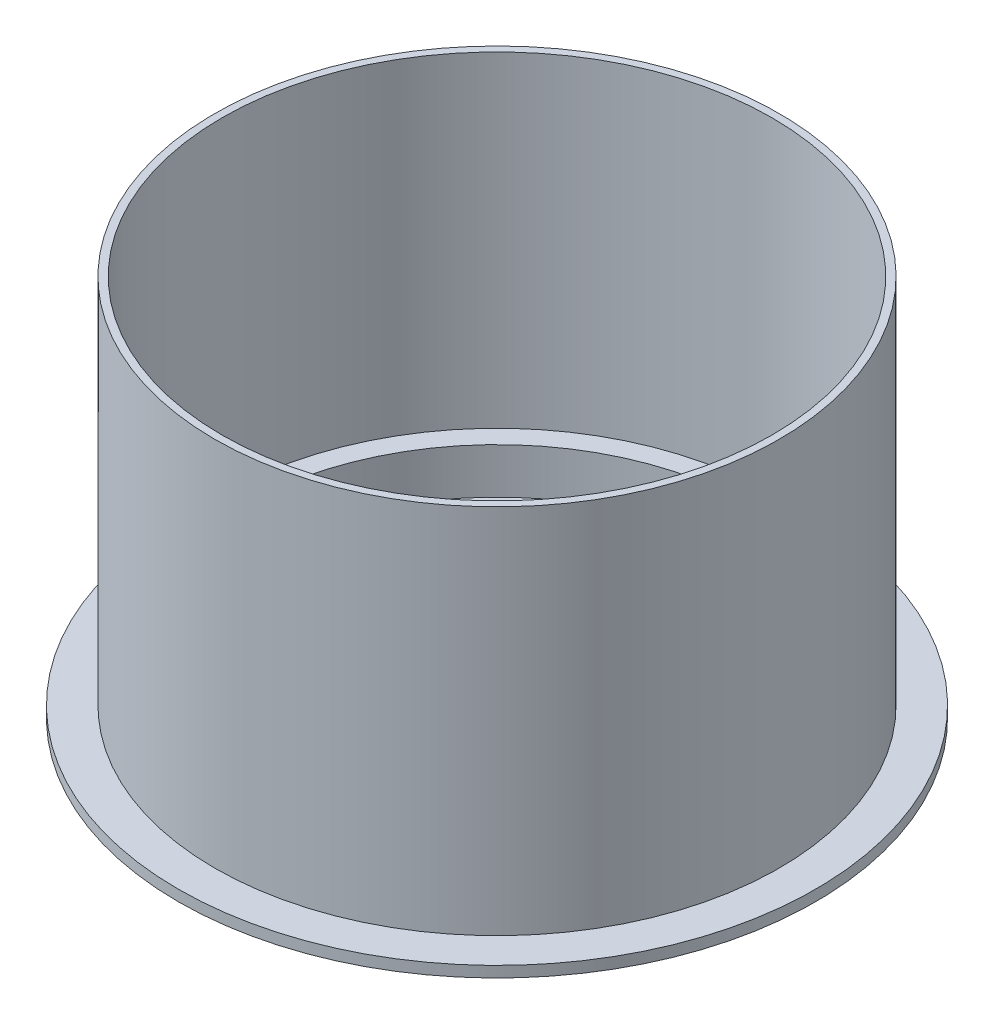
ISO-10303-21;
HEADER;
FILE_DESCRIPTION(('STEP AP214'),'2;1');
FILE_NAME('part.step','',(''),(''),'','','');
FILE_SCHEMA(('AUTOMOTIVE_DESIGN { 1 0 10303 214 1 1 1 1 }'));
ENDSEC;
DATA;
#1=APPLICATION_CONTEXT('core data for automotive mechanical design processes');
#2=APPLICATION_PROTOCOL_DEFINITION('international standard','automotive_design',2000,#1);
#3=PRODUCT_CONTEXT('',#1,'mechanical');
#4=PRODUCT('Part','Part','',(#3));
#5=PRODUCT_RELATED_PRODUCT_CATEGORY('part','',(#4));
#6=PRODUCT_DEFINITION_FORMATION('','',#4);
#7=PRODUCT_DEFINITION_CONTEXT('part definition',#1,'design');
#8=PRODUCT_DEFINITION('design','',#6,#7);
#9=PRODUCT_DEFINITION_SHAPE('','',#8);
#10=(LENGTH_UNIT() NAMED_UNIT(*) SI_UNIT(.MILLI.,.METRE.));
#11=(NAMED_UNIT(*) PLANE_ANGLE_UNIT() SI_UNIT($,.RADIAN.));
#12=(NAMED_UNIT(*) SI_UNIT($,.STERADIAN.) SOLID_ANGLE_UNIT());
#13=UNCERTAINTY_MEASURE_WITH_UNIT(LENGTH_MEASURE(1.E-05),#10,'distance_accuracy_value','');
#14=(GEOMETRIC_REPRESENTATION_CONTEXT(3) GLOBAL_UNCERTAINTY_ASSIGNED_CONTEXT((#13)) GLOBAL_UNIT_ASSIGNED_CONTEXT((#10,
#11,#12)) REPRESENTATION_CONTEXT('',''));
#15=CARTESIAN_POINT('',(0.,0.,0.));
#16=DIRECTION('',(0.,0.,1.));
#17=DIRECTION('',(1.,0.,0.));
#18=AXIS2_PLACEMENT_3D('',#15,#16,#17);
#19=CARTESIAN_POINT('',(0.,31.,0.));
#20=DIRECTION('',(0.,1.,0.));
#21=DIRECTION('',(0.,0.,1.));
#22=AXIS2_PLACEMENT_3D('',#19,#20,#21);
#23=PLANE('',#22);
#24=CARTESIAN_POINT('',(0.,31.,0.));
#25=DIRECTION('',(0.,1.,0.));
#26=DIRECTION('',(0.,0.,1.));
#27=AXIS2_PLACEMENT_3D('',#24,#25,#26);
#28=CIRCLE('',#27,140.);
#29=CARTESIAN_POINT('',(0.,31.,140.));
#30=VERTEX_POINT('',#29);
#31=EDGE_CURVE('E62',#30,#30,#28,.T.);
#32=ORIENTED_EDGE('',*,*,#31,.F.);
#33=EDGE_LOOP('',(#32));
#34=FACE_BOUND('',#33,.T.);
#35=CARTESIAN_POINT('',(0.,31.,0.));
#36=DIRECTION('',(0.,1.,0.));
#37=DIRECTION('',(0.,0.,1.));
#38=AXIS2_PLACEMENT_3D('',#35,#36,#37);
#39=CIRCLE('',#38,151.);
#40=CARTESIAN_POINT('',(0.,31.,151.));
#41=VERTEX_POINT('',#40);
#42=EDGE_CURVE('E10',#41,#41,#39,.F.);
#43=ORIENTED_EDGE('',*,*,#42,.F.);
#44=EDGE_LOOP('',(#43));
#45=FACE_BOUND('',#44,.T.);
#46=ADVANCED_FACE('F41',(#34,#45),#23,.T.);
#47=CARTESIAN_POINT('',(0.,6.,0.));
#48=DIRECTION('',(0.,1.,0.));
#49=DIRECTION('',(0.,0.,1.));
#50=AXIS2_PLACEMENT_3D('',#47,#48,#49);
#51=PLANE('',#50);
#52=CARTESIAN_POINT('',(0.,6.,0.));
#53=DIRECTION('',(0.,1.,0.));
#54=DIRECTION('',(0.,0.,1.));
#55=AXIS2_PLACEMENT_3D('',#52,#53,#54);
#56=CIRCLE('',#55,12.5);
#57=CARTESIAN_POINT('',(0.,6.,12.5));
#58=VERTEX_POINT('',#57);
#59=EDGE_CURVE('E64',#58,#58,#56,.T.);
#60=ORIENTED_EDGE('',*,*,#59,.F.);
#61=EDGE_LOOP('',(#60));
#62=FACE_BOUND('',#61,.T.);
#63=CARTESIAN_POINT('',(0.,6.,0.));
#64=DIRECTION('',(0.,1.,0.));
#65=DIRECTION('',(0.,0.,1.));
#66=AXIS2_PLACEMENT_3D('',#63,#64,#65);
#67=CIRCLE('',#66,140.);
#68=CARTESIAN_POINT('',(0.,6.,140.));
#69=VERTEX_POINT('',#68);
#70=EDGE_CURVE('E48',#69,#69,#67,.F.);
#71=ORIENTED_EDGE('',*,*,#70,.F.);
#72=EDGE_LOOP('',(#71));
#73=FACE_BOUND('',#72,.T.);
#74=ADVANCED_FACE('F94',(#62,#73),#51,.T.);
#75=CARTESIAN_POINT('',(0.,6.00000000000001,0.));
#76=DIRECTION('',(0.,1.,0.));
#77=DIRECTION('',(0.,0.,1.));
#78=AXIS2_PLACEMENT_3D('',#75,#76,#77);
#79=CIRCLE('',#78,155.);
#80=CARTESIAN_POINT('',(0.,6.00000000000001,155.));
#81=VERTEX_POINT('',#80);
#82=EDGE_CURVE('E125',#81,#81,#79,.F.);
#83=ORIENTED_EDGE('',*,*,#82,.T.);
#84=EDGE_LOOP('',(#83));
#85=FACE_BOUND('',#84,.T.);
#86=CARTESIAN_POINT('',(0.,6.,0.));
#87=DIRECTION('',(0.,1.,0.));
#88=DIRECTION('',(0.,0.,1.));
#89=AXIS2_PLACEMENT_3D('',#86,#87,#88);
#90=CIRCLE('',#89,175.);
#91=CARTESIAN_POINT('',(0.,6.,175.));
#92=VERTEX_POINT('',#91);
#93=EDGE_CURVE('E55',#92,#92,#90,.T.);
#94=ORIENTED_EDGE('',*,*,#93,.T.);
#95=EDGE_LOOP('',(#94));
#96=FACE_BOUND('',#95,.T.);
#97=ADVANCED_FACE('F73',(#85,#96),#51,.T.);
#98=CARTESIAN_POINT('',(0.,0.,0.));
#99=DIRECTION('',(0.,1.,0.));
#100=DIRECTION('',(0.,0.,1.));
#101=AXIS2_PLACEMENT_3D('',#98,#99,#100);
#102=PLANE('',#101);
#103=CARTESIAN_POINT('',(0.,0.,0.));
#104=DIRECTION('',(0.,1.,0.));
#105=DIRECTION('',(0.,0.,1.));
#106=AXIS2_PLACEMENT_3D('',#103,#104,#105);
#107=CIRCLE('',#106,175.);
#108=CARTESIAN_POINT('',(0.,0.,175.));
#109=VERTEX_POINT('',#108);
#110=EDGE_CURVE('E60',#109,#109,#107,.T.);
#111=ORIENTED_EDGE('',*,*,#110,.F.);
#112=EDGE_LOOP('',(#111));
#113=FACE_BOUND('',#112,.T.);
#114=CARTESIAN_POINT('',(0.,0.,0.));
#115=DIRECTION('',(0.,1.,0.));
#116=DIRECTION('',(0.,0.,1.));
#117=AXIS2_PLACEMENT_3D('',#114,#115,#116);
#118=CIRCLE('',#117,12.5);
#119=CARTESIAN_POINT('',(0.,0.,12.5));
#120=VERTEX_POINT('',#119);
#121=EDGE_CURVE('E67',#120,#120,#118,.T.);
#122=ORIENTED_EDGE('',*,*,#121,.T.);
#123=EDGE_LOOP('',(#122));
#124=FACE_BOUND('',#123,.T.);
#125=ADVANCED_FACE('F75',(#113,#124),#102,.F.);
#126=CARTESIAN_POINT('',(0.,6.,0.));
#127=DIRECTION('',(0.,-1.,0.));
#128=DIRECTION('',(0.,0.,-1.));
#129=AXIS2_PLACEMENT_3D('',#126,#127,#128);
#130=CYLINDRICAL_SURFACE('',#129,175.);
#131=ORIENTED_EDGE('',*,*,#93,.F.);
#132=EDGE_LOOP('',(#131));
#133=FACE_BOUND('',#132,.T.);
#134=ORIENTED_EDGE('',*,*,#110,.T.);
#135=EDGE_LOOP('',(#134));
#136=FACE_BOUND('',#135,.T.);
#137=ADVANCED_FACE('F43',(#133,#136),#130,.T.);
#138=CARTESIAN_POINT('',(0.,6.,0.));
#139=DIRECTION('',(0.,-1.,0.));
#140=DIRECTION('',(0.,0.,-1.));
#141=AXIS2_PLACEMENT_3D('',#138,#139,#140);
#142=CYLINDRICAL_SURFACE('',#141,12.5);
#143=ORIENTED_EDGE('',*,*,#59,.T.);
#144=EDGE_LOOP('',(#143));
#145=FACE_BOUND('',#144,.T.);
#146=ORIENTED_EDGE('',*,*,#121,.F.);
#147=EDGE_LOOP('',(#146));
#148=FACE_BOUND('',#147,.T.);
#149=ADVANCED_FACE('F79',(#145,#148),#142,.F.);
#150=CARTESIAN_POINT('',(0.,31.,0.));
#151=DIRECTION('',(0.,-1.,0.));
#152=DIRECTION('',(0.,0.,-1.));
#153=AXIS2_PLACEMENT_3D('',#150,#151,#152);
#154=CYLINDRICAL_SURFACE('',#153,140.);
#155=ORIENTED_EDGE('',*,*,#70,.T.);
#156=EDGE_LOOP('',(#155));
#157=FACE_BOUND('',#156,.T.);
#158=ORIENTED_EDGE('',*,*,#31,.T.);
#159=EDGE_LOOP('',(#158));
#160=FACE_BOUND('',#159,.T.);
#161=ADVANCED_FACE('F78',(#157,#160),#154,.F.);
#162=CARTESIAN_POINT('',(0.,210.,0.));
#163=DIRECTION('',(0.,1.,0.));
#164=DIRECTION('',(0.,0.,1.));
#165=AXIS2_PLACEMENT_3D('',#162,#163,#164);
#166=PLANE('',#165);
#167=CARTESIAN_POINT('',(0.,210.,0.));
#168=DIRECTION('',(0.,1.,0.));
#169=DIRECTION('',(0.,0.,1.));
#170=AXIS2_PLACEMENT_3D('',#167,#168,#169);
#171=CIRCLE('',#170,155.);
#172=CARTESIAN_POINT('',(0.,210.,155.));
#173=VERTEX_POINT('',#172);
#174=EDGE_CURVE('E116',#173,#173,#171,.T.);
#175=ORIENTED_EDGE('',*,*,#174,.T.);
#176=EDGE_LOOP('',(#175));
#177=FACE_BOUND('',#176,.T.);
#178=CARTESIAN_POINT('',(0.,210.,0.));
#179=DIRECTION('',(0.,1.,0.));
#180=DIRECTION('',(0.,0.,1.));
#181=AXIS2_PLACEMENT_3D('',#178,#179,#180);
#182=CIRCLE('',#181,151.);
#183=CARTESIAN_POINT('',(0.,210.,151.));
#184=VERTEX_POINT('',#183);
#185=EDGE_CURVE('E120',#184,#184,#182,.T.);
#186=ORIENTED_EDGE('',*,*,#185,.F.);
#187=EDGE_LOOP('',(#186));
#188=FACE_BOUND('',#187,.T.);
#189=ADVANCED_FACE('F86',(#177,#188),#166,.T.);
#190=CARTESIAN_POINT('',(0.,210.,0.));
#191=DIRECTION('',(0.,-1.,0.));
#192=DIRECTION('',(0.,0.,-1.));
#193=AXIS2_PLACEMENT_3D('',#190,#191,#192);
#194=CYLINDRICAL_SURFACE('',#193,155.);
#195=ORIENTED_EDGE('',*,*,#82,.F.);
#196=EDGE_LOOP('',(#195));
#197=FACE_BOUND('',#196,.T.);
#198=ORIENTED_EDGE('',*,*,#174,.F.);
#199=EDGE_LOOP('',(#198));
#200=FACE_BOUND('',#199,.T.);
#201=ADVANCED_FACE('F103',(#197,#200),#194,.T.);
#202=CARTESIAN_POINT('',(0.,210.,0.));
#203=DIRECTION('',(0.,-1.,0.));
#204=DIRECTION('',(0.,0.,-1.));
#205=AXIS2_PLACEMENT_3D('',#202,#203,#204);
#206=CYLINDRICAL_SURFACE('',#205,151.);
#207=ORIENTED_EDGE('',*,*,#42,.T.);
#208=EDGE_LOOP('',(#207));
#209=FACE_BOUND('',#208,.T.);
#210=ORIENTED_EDGE('',*,*,#185,.T.);
#211=EDGE_LOOP('',(#210));
#212=FACE_BOUND('',#211,.T.);
#213=ADVANCED_FACE('F106',(#209,#212),#206,.F.);
#214=CLOSED_SHELL('',(#46,#74,#97,#125,#137,#149,#161,#189,#201,#213));
#215=MANIFOLD_SOLID_BREP('B2',#214);
#216=ADVANCED_BREP_SHAPE_REPRESENTATION('',(#18,#215),#14);
#217=SHAPE_DEFINITION_REPRESENTATION(#9,#216);
ENDSEC;
END-ISO-10303-21;
